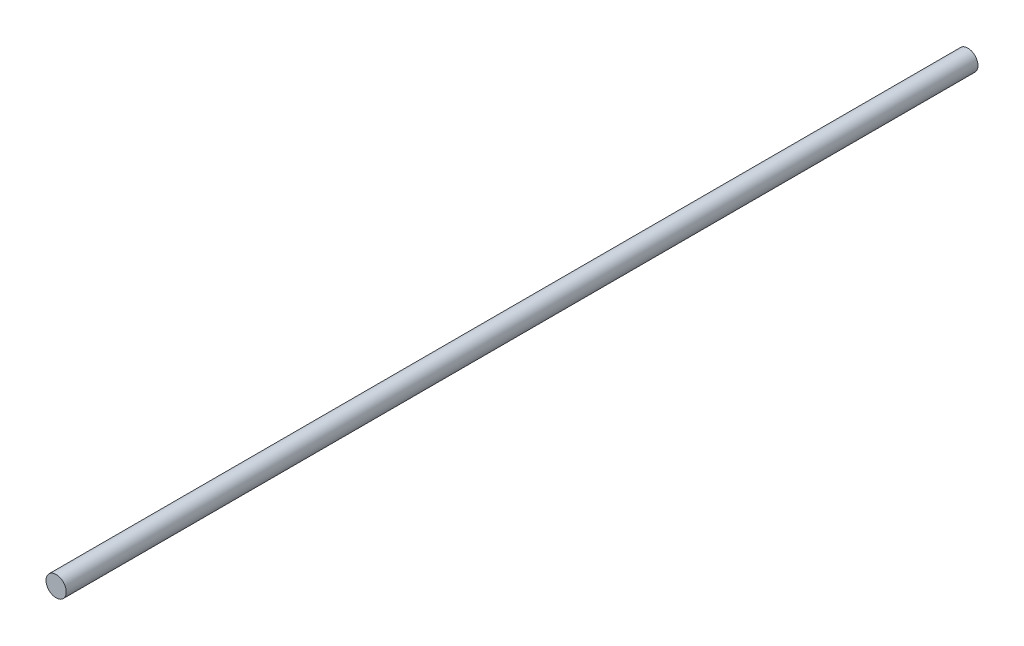
ISO-10303-21;
HEADER;
FILE_DESCRIPTION(('STEP AP214'),'2;1');
FILE_NAME('part.step','',(''),(''),'','','');
FILE_SCHEMA(('AUTOMOTIVE_DESIGN { 1 0 10303 214 1 1 1 1 }'));
ENDSEC;
DATA;
#1=APPLICATION_CONTEXT('core data for automotive mechanical design processes');
#2=APPLICATION_PROTOCOL_DEFINITION('international standard','automotive_design',2000,#1);
#3=PRODUCT_CONTEXT('',#1,'mechanical');
#4=PRODUCT('Part','Part','',(#3));
#5=PRODUCT_RELATED_PRODUCT_CATEGORY('part','',(#4));
#6=PRODUCT_DEFINITION_FORMATION('','',#4);
#7=PRODUCT_DEFINITION_CONTEXT('part definition',#1,'design');
#8=PRODUCT_DEFINITION('design','',#6,#7);
#9=PRODUCT_DEFINITION_SHAPE('','',#8);
#10=(LENGTH_UNIT() NAMED_UNIT(*) SI_UNIT(.MILLI.,.METRE.));
#11=(NAMED_UNIT(*) PLANE_ANGLE_UNIT() SI_UNIT($,.RADIAN.));
#12=(NAMED_UNIT(*) SI_UNIT($,.STERADIAN.) SOLID_ANGLE_UNIT());
#13=UNCERTAINTY_MEASURE_WITH_UNIT(LENGTH_MEASURE(1.E-05),#10,'distance_accuracy_value','');
#14=(GEOMETRIC_REPRESENTATION_CONTEXT(3) GLOBAL_UNCERTAINTY_ASSIGNED_CONTEXT((#13)) GLOBAL_UNIT_ASSIGNED_CONTEXT((#10,
#11,#12)) REPRESENTATION_CONTEXT('',''));
#15=CARTESIAN_POINT('',(0.,0.,0.));
#16=DIRECTION('',(0.,0.,1.));
#17=DIRECTION('',(1.,0.,0.));
#18=AXIS2_PLACEMENT_3D('',#15,#16,#17);
#19=CARTESIAN_POINT('',(0.,0.,225.));
#20=DIRECTION('',(0.,0.,-1.));
#21=DIRECTION('',(-1.,0.,0.));
#22=AXIS2_PLACEMENT_3D('',#19,#20,#21);
#23=CYLINDRICAL_SURFACE('',#22,2.5);
#24=CARTESIAN_POINT('',(0.,0.,225.));
#25=DIRECTION('',(0.,0.,1.));
#26=DIRECTION('',(1.,0.,0.));
#27=AXIS2_PLACEMENT_3D('',#24,#25,#26);
#28=CIRCLE('',#27,2.5);
#29=CARTESIAN_POINT('',(2.5,0.,225.));
#30=VERTEX_POINT('',#29);
#31=EDGE_CURVE('E10',#30,#30,#28,.T.);
#32=ORIENTED_EDGE('',*,*,#31,.F.);
#33=EDGE_LOOP('',(#32));
#34=FACE_BOUND('',#33,.T.);
#35=CARTESIAN_POINT('',(0.,0.,0.));
#36=DIRECTION('',(0.,0.,1.));
#37=DIRECTION('',(1.,0.,0.));
#38=AXIS2_PLACEMENT_3D('',#35,#36,#37);
#39=CIRCLE('',#38,2.5);
#40=CARTESIAN_POINT('',(2.5,0.,0.));
#41=VERTEX_POINT('',#40);
#42=EDGE_CURVE('E46',#41,#41,#39,.T.);
#43=ORIENTED_EDGE('',*,*,#42,.T.);
#44=EDGE_LOOP('',(#43));
#45=FACE_BOUND('',#44,.T.);
#46=ADVANCED_FACE('F43',(#34,#45),#23,.T.);
#47=CARTESIAN_POINT('',(0.,0.,225.));
#48=DIRECTION('',(0.,0.,1.));
#49=DIRECTION('',(1.,0.,0.));
#50=AXIS2_PLACEMENT_3D('',#47,#48,#49);
#51=PLANE('',#50);
#52=ORIENTED_EDGE('',*,*,#31,.T.);
#53=EDGE_LOOP('',(#52));
#54=FACE_BOUND('',#53,.T.);
#55=ADVANCED_FACE('F60',(#54),#51,.T.);
#56=CARTESIAN_POINT('',(0.,0.,0.));
#57=DIRECTION('',(0.,0.,1.));
#58=DIRECTION('',(1.,0.,0.));
#59=AXIS2_PLACEMENT_3D('',#56,#57,#58);
#60=PLANE('',#59);
#61=ORIENTED_EDGE('',*,*,#42,.F.);
#62=EDGE_LOOP('',(#61));
#63=FACE_BOUND('',#62,.T.);
#64=ADVANCED_FACE('F58',(#63),#60,.F.);
#65=CLOSED_SHELL('',(#46,#55,#64));
#66=MANIFOLD_SOLID_BREP('B2',#65);
#67=ADVANCED_BREP_SHAPE_REPRESENTATION('',(#18,#66),#14);
#68=SHAPE_DEFINITION_REPRESENTATION(#9,#67);
ENDSEC;
END-ISO-10303-21;
